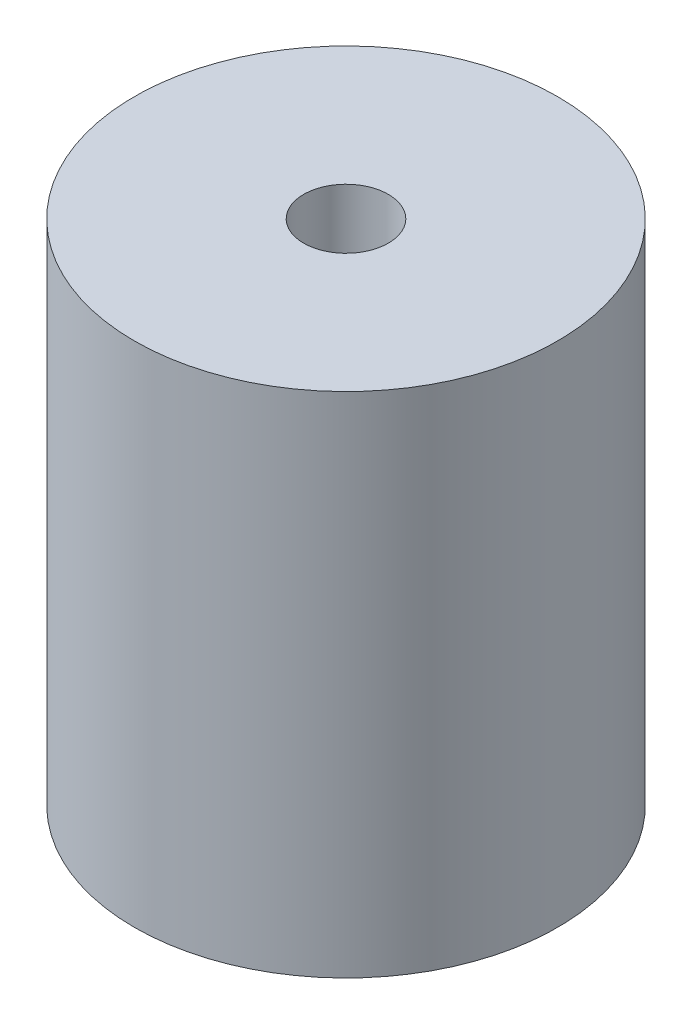
ISO-10303-21;
HEADER;
FILE_DESCRIPTION(('STEP AP214'),'2;1');
FILE_NAME('part.step','',(''),(''),'','','');
FILE_SCHEMA(('AUTOMOTIVE_DESIGN { 1 0 10303 214 1 1 1 1 }'));
ENDSEC;
DATA;
#1=APPLICATION_CONTEXT('core data for automotive mechanical design processes');
#2=APPLICATION_PROTOCOL_DEFINITION('international standard','automotive_design',2000,#1);
#3=PRODUCT_CONTEXT('',#1,'mechanical');
#4=PRODUCT('Part','Part','',(#3));
#5=PRODUCT_RELATED_PRODUCT_CATEGORY('part','',(#4));
#6=PRODUCT_DEFINITION_FORMATION('','',#4);
#7=PRODUCT_DEFINITION_CONTEXT('part definition',#1,'design');
#8=PRODUCT_DEFINITION('design','',#6,#7);
#9=PRODUCT_DEFINITION_SHAPE('','',#8);
#10=(LENGTH_UNIT() NAMED_UNIT(*) SI_UNIT(.MILLI.,.METRE.));
#11=(NAMED_UNIT(*) PLANE_ANGLE_UNIT() SI_UNIT($,.RADIAN.));
#12=(NAMED_UNIT(*) SI_UNIT($,.STERADIAN.) SOLID_ANGLE_UNIT());
#13=UNCERTAINTY_MEASURE_WITH_UNIT(LENGTH_MEASURE(1.E-05),#10,'distance_accuracy_value','');
#14=(GEOMETRIC_REPRESENTATION_CONTEXT(3) GLOBAL_UNCERTAINTY_ASSIGNED_CONTEXT((#13)) GLOBAL_UNIT_ASSIGNED_CONTEXT((#10,
#11,#12)) REPRESENTATION_CONTEXT('',''));
#15=CARTESIAN_POINT('',(0.,0.,0.));
#16=DIRECTION('',(0.,0.,1.));
#17=DIRECTION('',(1.,0.,0.));
#18=AXIS2_PLACEMENT_3D('',#15,#16,#17);
#19=CARTESIAN_POINT('',(0.,15.,0.));
#20=DIRECTION('',(0.,-1.,0.));
#21=DIRECTION('',(0.,0.,-1.));
#22=AXIS2_PLACEMENT_3D('',#19,#20,#21);
#23=CYLINDRICAL_SURFACE('',#22,12.5);
#24=CARTESIAN_POINT('',(0.,15.,0.));
#25=DIRECTION('',(0.,1.,0.));
#26=DIRECTION('',(0.,0.,1.));
#27=AXIS2_PLACEMENT_3D('',#24,#25,#26);
#28=CIRCLE('',#27,12.5);
#29=CARTESIAN_POINT('',(0.,15.,12.5));
#30=VERTEX_POINT('',#29);
#31=EDGE_CURVE('E10',#30,#30,#28,.T.);
#32=ORIENTED_EDGE('',*,*,#31,.F.);
#33=EDGE_LOOP('',(#32));
#34=FACE_BOUND('',#33,.T.);
#35=CARTESIAN_POINT('',(0.,-15.,0.));
#36=DIRECTION('',(0.,1.,0.));
#37=DIRECTION('',(0.,0.,1.));
#38=AXIS2_PLACEMENT_3D('',#35,#36,#37);
#39=CIRCLE('',#38,12.5);
#40=CARTESIAN_POINT('',(0.,-15.,12.5));
#41=VERTEX_POINT('',#40);
#42=EDGE_CURVE('E38',#41,#41,#39,.T.);
#43=ORIENTED_EDGE('',*,*,#42,.T.);
#44=EDGE_LOOP('',(#43));
#45=FACE_BOUND('',#44,.T.);
#46=ADVANCED_FACE('F35',(#34,#45),#23,.T.);
#47=CARTESIAN_POINT('',(0.,15.,0.));
#48=DIRECTION('',(0.,1.,0.));
#49=DIRECTION('',(0.,0.,1.));
#50=AXIS2_PLACEMENT_3D('',#47,#48,#49);
#51=PLANE('',#50);
#52=CARTESIAN_POINT('',(0.,15.,0.));
#53=DIRECTION('',(0.,1.,0.));
#54=DIRECTION('',(0.,0.,1.));
#55=AXIS2_PLACEMENT_3D('',#52,#53,#54);
#56=CIRCLE('',#55,2.5);
#57=CARTESIAN_POINT('',(0.,15.,2.5));
#58=VERTEX_POINT('',#57);
#59=EDGE_CURVE('E45',#58,#58,#56,.T.);
#60=ORIENTED_EDGE('',*,*,#59,.F.);
#61=EDGE_LOOP('',(#60));
#62=FACE_BOUND('',#61,.T.);
#63=ORIENTED_EDGE('',*,*,#31,.T.);
#64=EDGE_LOOP('',(#63));
#65=FACE_BOUND('',#64,.T.);
#66=ADVANCED_FACE('F72',(#62,#65),#51,.T.);
#67=CARTESIAN_POINT('',(0.,-15.,0.));
#68=DIRECTION('',(0.,1.,0.));
#69=DIRECTION('',(0.,0.,1.));
#70=AXIS2_PLACEMENT_3D('',#67,#68,#69);
#71=PLANE('',#70);
#72=CARTESIAN_POINT('',(0.,-15.,0.));
#73=DIRECTION('',(0.,-1.,0.));
#74=DIRECTION('',(0.,0.,-1.));
#75=AXIS2_PLACEMENT_3D('',#72,#73,#74);
#76=CIRCLE('',#75,5.);
#77=CARTESIAN_POINT('',(0.,-15.,-5.));
#78=VERTEX_POINT('',#77);
#79=EDGE_CURVE('E53',#78,#78,#76,.T.);
#80=ORIENTED_EDGE('',*,*,#79,.F.);
#81=EDGE_LOOP('',(#80));
#82=FACE_BOUND('',#81,.T.);
#83=ORIENTED_EDGE('',*,*,#42,.F.);
#84=EDGE_LOOP('',(#83));
#85=FACE_BOUND('',#84,.T.);
#86=ADVANCED_FACE('F68',(#82,#85),#71,.F.);
#87=CARTESIAN_POINT('',(0.,0.,0.));
#88=DIRECTION('',(0.,1.,0.));
#89=DIRECTION('',(0.,0.,1.));
#90=AXIS2_PLACEMENT_3D('',#87,#88,#89);
#91=CYLINDRICAL_SURFACE('',#90,2.5);
#92=CARTESIAN_POINT('',(0.,0.,0.));
#93=DIRECTION('',(0.,1.,0.));
#94=DIRECTION('',(0.,0.,1.));
#95=AXIS2_PLACEMENT_3D('',#92,#93,#94);
#96=CIRCLE('',#95,2.5);
#97=CARTESIAN_POINT('',(0.,0.,2.5));
#98=VERTEX_POINT('',#97);
#99=EDGE_CURVE('E49',#98,#98,#96,.T.);
#100=ORIENTED_EDGE('',*,*,#99,.F.);
#101=EDGE_LOOP('',(#100));
#102=FACE_BOUND('',#101,.T.);
#103=ORIENTED_EDGE('',*,*,#59,.T.);
#104=EDGE_LOOP('',(#103));
#105=FACE_BOUND('',#104,.T.);
#106=ADVANCED_FACE('F71',(#102,#105),#91,.F.);
#107=CARTESIAN_POINT('',(0.,0.,0.));
#108=DIRECTION('',(0.,-1.,0.));
#109=DIRECTION('',(0.,0.,-1.));
#110=AXIS2_PLACEMENT_3D('',#107,#108,#109);
#111=PLANE('',#110);
#112=CARTESIAN_POINT('',(0.,0.,0.));
#113=DIRECTION('',(0.,-1.,0.));
#114=DIRECTION('',(0.,0.,-1.));
#115=AXIS2_PLACEMENT_3D('',#112,#113,#114);
#116=CIRCLE('',#115,5.);
#117=CARTESIAN_POINT('',(0.,0.,-5.));
#118=VERTEX_POINT('',#117);
#119=EDGE_CURVE('E52',#118,#118,#116,.T.);
#120=ORIENTED_EDGE('',*,*,#119,.T.);
#121=EDGE_LOOP('',(#120));
#122=FACE_BOUND('',#121,.T.);
#123=ORIENTED_EDGE('',*,*,#99,.T.);
#124=EDGE_LOOP('',(#123));
#125=FACE_BOUND('',#124,.T.);
#126=ADVANCED_FACE('F59',(#122,#125),#111,.T.);
#127=CARTESIAN_POINT('',(0.,0.,0.));
#128=DIRECTION('',(0.,-1.,0.));
#129=DIRECTION('',(0.,0.,-1.));
#130=AXIS2_PLACEMENT_3D('',#127,#128,#129);
#131=CYLINDRICAL_SURFACE('',#130,5.);
#132=ORIENTED_EDGE('',*,*,#119,.F.);
#133=EDGE_LOOP('',(#132));
#134=FACE_BOUND('',#133,.T.);
#135=ORIENTED_EDGE('',*,*,#79,.T.);
#136=EDGE_LOOP('',(#135));
#137=FACE_BOUND('',#136,.T.);
#138=ADVANCED_FACE('F62',(#134,#137),#131,.F.);
#139=CLOSED_SHELL('',(#46,#66,#86,#106,#126,#138));
#140=MANIFOLD_SOLID_BREP('B2',#139);
#141=ADVANCED_BREP_SHAPE_REPRESENTATION('',(#18,#140),#14);
#142=SHAPE_DEFINITION_REPRESENTATION(#9,#141);
ENDSEC;
END-ISO-10303-21;
